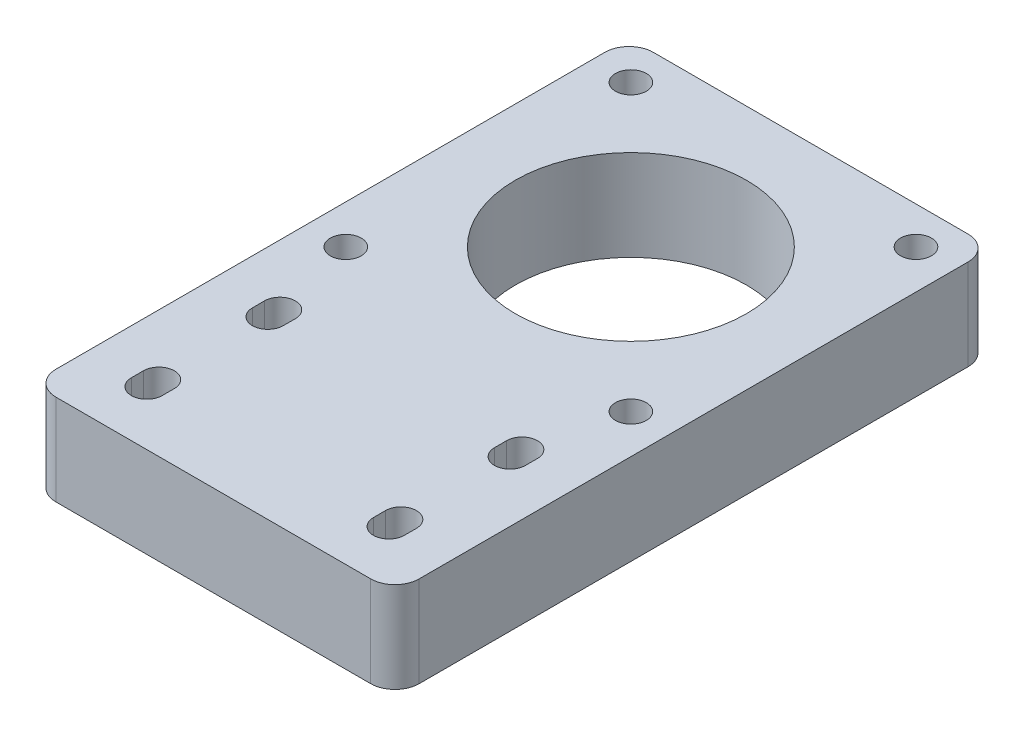
ISO-10303-21;
HEADER;
FILE_DESCRIPTION(('STEP AP214'),'2;1');
FILE_NAME('part.step','',(''),(''),'','','');
FILE_SCHEMA(('AUTOMOTIVE_DESIGN { 1 0 10303 214 1 1 1 1 }'));
ENDSEC;
DATA;
#1=APPLICATION_CONTEXT('core data for automotive mechanical design processes');
#2=APPLICATION_PROTOCOL_DEFINITION('international standard','automotive_design',2000,#1);
#3=PRODUCT_CONTEXT('',#1,'mechanical');
#4=PRODUCT('Part','Part','',(#3));
#5=PRODUCT_RELATED_PRODUCT_CATEGORY('part','',(#4));
#6=PRODUCT_DEFINITION_FORMATION('','',#4);
#7=PRODUCT_DEFINITION_CONTEXT('part definition',#1,'design');
#8=PRODUCT_DEFINITION('design','',#6,#7);
#9=PRODUCT_DEFINITION_SHAPE('','',#8);
#10=(LENGTH_UNIT() NAMED_UNIT(*) SI_UNIT(.MILLI.,.METRE.));
#11=(NAMED_UNIT(*) PLANE_ANGLE_UNIT() SI_UNIT($,.RADIAN.));
#12=(NAMED_UNIT(*) SI_UNIT($,.STERADIAN.) SOLID_ANGLE_UNIT());
#13=UNCERTAINTY_MEASURE_WITH_UNIT(LENGTH_MEASURE(1.E-05),#10,'distance_accuracy_value','');
#14=(GEOMETRIC_REPRESENTATION_CONTEXT(3) GLOBAL_UNCERTAINTY_ASSIGNED_CONTEXT((#13)) GLOBAL_UNIT_ASSIGNED_CONTEXT((#10,
#11,#12)) REPRESENTATION_CONTEXT('',''));
#15=CARTESIAN_POINT('',(0.,0.,0.));
#16=DIRECTION('',(0.,0.,1.));
#17=DIRECTION('',(1.,0.,0.));
#18=AXIS2_PLACEMENT_3D('',#15,#16,#17);
#19=CARTESIAN_POINT('',(-26.,15.,64.98));
#20=DIRECTION('',(0.,-1.,0.));
#21=DIRECTION('',(0.,0.,-1.));
#22=AXIS2_PLACEMENT_3D('',#19,#20,#21);
#23=PLANE('',#22);
#24=CARTESIAN_POINT('',(20.,15.,37.98));
#25=DIRECTION('',(0.,1.,0.));
#26=DIRECTION('',(0.,0.,1.));
#27=AXIS2_PLACEMENT_3D('',#24,#25,#26);
#28=CIRCLE('',#27,2.54999999999999);
#29=CARTESIAN_POINT('',(22.55,15.,37.98));
#30=VERTEX_POINT('',#29);
#31=CARTESIAN_POINT('',(17.45,15.,37.98));
#32=VERTEX_POINT('',#31);
#33=EDGE_CURVE('E234',#30,#32,#28,.T.);
#34=ORIENTED_EDGE('',*,*,#33,.F.);
#35=DIRECTION('',(0.,0.,-1.));
#36=VECTOR('',#35,1.);
#37=CARTESIAN_POINT('',(22.55,15.,37.98));
#38=LINE('',#37,#36);
#39=CARTESIAN_POINT('',(22.55,15.,39.98));
#40=VERTEX_POINT('',#39);
#41=EDGE_CURVE('E242',#40,#30,#38,.T.);
#42=ORIENTED_EDGE('',*,*,#41,.F.);
#43=CARTESIAN_POINT('',(20.,15.,39.98));
#44=DIRECTION('',(0.,1.,0.));
#45=DIRECTION('',(0.,0.,-1.));
#46=AXIS2_PLACEMENT_3D('',#43,#44,#45);
#47=CIRCLE('',#46,2.54999999999999);
#48=CARTESIAN_POINT('',(17.45,15.,39.98));
#49=VERTEX_POINT('',#48);
#50=EDGE_CURVE('E239',#49,#40,#47,.T.);
#51=ORIENTED_EDGE('',*,*,#50,.F.);
#52=DIRECTION('',(0.,0.,1.));
#53=VECTOR('',#52,1.);
#54=CARTESIAN_POINT('',(17.45,15.,37.98));
#55=LINE('',#54,#53);
#56=EDGE_CURVE('E236',#32,#49,#55,.T.);
#57=ORIENTED_EDGE('',*,*,#56,.F.);
#58=EDGE_LOOP('',(#34,#42,#51,#57));
#59=FACE_BOUND('',#58,.T.);
#60=CARTESIAN_POINT('',(-20.,15.,37.98));
#61=DIRECTION('',(0.,1.,0.));
#62=DIRECTION('',(0.,0.,-1.));
#63=AXIS2_PLACEMENT_3D('',#60,#61,#62);
#64=CIRCLE('',#63,2.54999999999999);
#65=CARTESIAN_POINT('',(-17.45,15.,37.98));
#66=VERTEX_POINT('',#65);
#67=CARTESIAN_POINT('',(-22.55,15.,37.98));
#68=VERTEX_POINT('',#67);
#69=EDGE_CURVE('E296',#66,#68,#64,.T.);
#70=ORIENTED_EDGE('',*,*,#69,.F.);
#71=DIRECTION('',(0.,0.,-1.));
#72=VECTOR('',#71,1.);
#73=CARTESIAN_POINT('',(-17.45,15.,37.98));
#74=LINE('',#73,#72);
#75=CARTESIAN_POINT('',(-17.45,15.,39.98));
#76=VERTEX_POINT('',#75);
#77=EDGE_CURVE('E304',#76,#66,#74,.T.);
#78=ORIENTED_EDGE('',*,*,#77,.F.);
#79=CARTESIAN_POINT('',(-20.,15.,39.98));
#80=DIRECTION('',(0.,1.,0.));
#81=DIRECTION('',(0.,0.,1.));
#82=AXIS2_PLACEMENT_3D('',#79,#80,#81);
#83=CIRCLE('',#82,2.54999999999999);
#84=CARTESIAN_POINT('',(-22.55,15.,39.98));
#85=VERTEX_POINT('',#84);
#86=EDGE_CURVE('E301',#85,#76,#83,.T.);
#87=ORIENTED_EDGE('',*,*,#86,.F.);
#88=DIRECTION('',(0.,0.,1.));
#89=VECTOR('',#88,1.);
#90=CARTESIAN_POINT('',(-22.55,15.,37.98));
#91=LINE('',#90,#89);
#92=EDGE_CURVE('E298',#68,#85,#91,.T.);
#93=ORIENTED_EDGE('',*,*,#92,.F.);
#94=EDGE_LOOP('',(#70,#78,#87,#93));
#95=FACE_BOUND('',#94,.T.);
#96=CARTESIAN_POINT('',(-26.,15.,64.98));
#97=DIRECTION('',(0.,1.,0.));
#98=DIRECTION('',(0.,0.,-1.));
#99=AXIS2_PLACEMENT_3D('',#96,#97,#98);
#100=CIRCLE('',#99,4.);
#101=CARTESIAN_POINT('',(-30.,15.,64.98));
#102=VERTEX_POINT('',#101);
#103=CARTESIAN_POINT('',(-26.,15.,68.98));
#104=VERTEX_POINT('',#103);
#105=EDGE_CURVE('E357',#102,#104,#100,.T.);
#106=ORIENTED_EDGE('',*,*,#105,.T.);
#107=DIRECTION('',(1.,0.,0.));
#108=VECTOR('',#107,1.);
#109=CARTESIAN_POINT('',(-26.,15.,68.98));
#110=LINE('',#109,#108);
#111=CARTESIAN_POINT('',(26.,15.,68.98));
#112=VERTEX_POINT('',#111);
#113=EDGE_CURVE('E360',#104,#112,#110,.T.);
#114=ORIENTED_EDGE('',*,*,#113,.T.);
#115=CARTESIAN_POINT('',(26.,15.,64.98));
#116=DIRECTION('',(0.,1.,0.));
#117=DIRECTION('',(0.,0.,1.));
#118=AXIS2_PLACEMENT_3D('',#115,#116,#117);
#119=CIRCLE('',#118,4.);
#120=CARTESIAN_POINT('',(30.,15.,64.98));
#121=VERTEX_POINT('',#120);
#122=EDGE_CURVE('E363',#112,#121,#119,.T.);
#123=ORIENTED_EDGE('',*,*,#122,.T.);
#124=DIRECTION('',(0.,0.,-1.));
#125=VECTOR('',#124,1.);
#126=CARTESIAN_POINT('',(30.,15.,-25.7));
#127=LINE('',#126,#125);
#128=CARTESIAN_POINT('',(30.,15.,-25.7));
#129=VERTEX_POINT('',#128);
#130=EDGE_CURVE('E365',#121,#129,#127,.T.);
#131=ORIENTED_EDGE('',*,*,#130,.T.);
#132=CARTESIAN_POINT('',(26.,15.,-25.7));
#133=DIRECTION('',(0.,1.,0.));
#134=DIRECTION('',(0.,0.,1.));
#135=AXIS2_PLACEMENT_3D('',#132,#133,#134);
#136=CIRCLE('',#135,4.);
#137=CARTESIAN_POINT('',(26.,15.,-29.7));
#138=VERTEX_POINT('',#137);
#139=EDGE_CURVE('E367',#129,#138,#136,.T.);
#140=ORIENTED_EDGE('',*,*,#139,.T.);
#141=DIRECTION('',(-1.,0.,0.));
#142=VECTOR('',#141,1.);
#143=CARTESIAN_POINT('',(-26.,15.,-29.7));
#144=LINE('',#143,#142);
#145=CARTESIAN_POINT('',(-26.,15.,-29.7));
#146=VERTEX_POINT('',#145);
#147=EDGE_CURVE('E369',#138,#146,#144,.T.);
#148=ORIENTED_EDGE('',*,*,#147,.T.);
#149=CARTESIAN_POINT('',(-26.,15.,-25.7));
#150=DIRECTION('',(0.,1.,0.));
#151=DIRECTION('',(0.,0.,1.));
#152=AXIS2_PLACEMENT_3D('',#149,#150,#151);
#153=CIRCLE('',#152,4.);
#154=CARTESIAN_POINT('',(-30.,15.,-25.7));
#155=VERTEX_POINT('',#154);
#156=EDGE_CURVE('E371',#146,#155,#153,.T.);
#157=ORIENTED_EDGE('',*,*,#156,.T.);
#158=DIRECTION('',(0.,0.,1.));
#159=VECTOR('',#158,1.);
#160=CARTESIAN_POINT('',(-30.,15.,-25.7));
#161=LINE('',#160,#159);
#162=EDGE_CURVE('E373',#155,#102,#161,.T.);
#163=ORIENTED_EDGE('',*,*,#162,.T.);
#164=EDGE_LOOP('',(#106,#114,#123,#131,#140,#148,#157,#163));
#165=FACE_BOUND('',#164,.T.);
#166=CARTESIAN_POINT('',(0.,15.,0.));
#167=DIRECTION('',(0.,1.,0.));
#168=DIRECTION('',(0.,0.,1.));
#169=AXIS2_PLACEMENT_3D('',#166,#167,#168);
#170=CIRCLE('',#169,19.1);
#171=CARTESIAN_POINT('',(0.,15.,19.1));
#172=VERTEX_POINT('',#171);
#173=EDGE_CURVE('E351',#172,#172,#170,.T.);
#174=ORIENTED_EDGE('',*,*,#173,.F.);
#175=EDGE_LOOP('',(#174));
#176=FACE_BOUND('',#175,.T.);
#177=CARTESIAN_POINT('',(-23.55,15.,-23.55));
#178=DIRECTION('',(0.,1.,0.));
#179=DIRECTION('',(0.,0.,1.));
#180=AXIS2_PLACEMENT_3D('',#177,#178,#179);
#181=CIRCLE('',#180,2.55);
#182=CARTESIAN_POINT('',(-23.55,15.,-21.));
#183=VERTEX_POINT('',#182);
#184=EDGE_CURVE('E345',#183,#183,#181,.T.);
#185=ORIENTED_EDGE('',*,*,#184,.F.);
#186=EDGE_LOOP('',(#185));
#187=FACE_BOUND('',#186,.T.);
#188=CARTESIAN_POINT('',(23.55,15.,-23.55));
#189=DIRECTION('',(0.,1.,0.));
#190=DIRECTION('',(0.,0.,-1.));
#191=AXIS2_PLACEMENT_3D('',#188,#189,#190);
#192=CIRCLE('',#191,2.55);
#193=CARTESIAN_POINT('',(23.55,15.,-26.1));
#194=VERTEX_POINT('',#193);
#195=EDGE_CURVE('E339',#194,#194,#192,.T.);
#196=ORIENTED_EDGE('',*,*,#195,.F.);
#197=EDGE_LOOP('',(#196));
#198=FACE_BOUND('',#197,.T.);
#199=CARTESIAN_POINT('',(23.55,15.,23.55));
#200=DIRECTION('',(0.,1.,0.));
#201=DIRECTION('',(0.,0.,1.));
#202=AXIS2_PLACEMENT_3D('',#199,#200,#201);
#203=CIRCLE('',#202,2.55);
#204=CARTESIAN_POINT('',(23.55,15.,26.1));
#205=VERTEX_POINT('',#204);
#206=EDGE_CURVE('E333',#205,#205,#203,.T.);
#207=ORIENTED_EDGE('',*,*,#206,.F.);
#208=EDGE_LOOP('',(#207));
#209=FACE_BOUND('',#208,.T.);
#210=CARTESIAN_POINT('',(-23.55,15.,23.55));
#211=DIRECTION('',(0.,1.,0.));
#212=DIRECTION('',(0.,0.,-1.));
#213=AXIS2_PLACEMENT_3D('',#210,#211,#212);
#214=CIRCLE('',#213,2.55);
#215=CARTESIAN_POINT('',(-23.55,15.,21.));
#216=VERTEX_POINT('',#215);
#217=EDGE_CURVE('E327',#216,#216,#214,.T.);
#218=ORIENTED_EDGE('',*,*,#217,.F.);
#219=EDGE_LOOP('',(#218));
#220=FACE_BOUND('',#219,.T.);
#221=CARTESIAN_POINT('',(-20.,15.,57.98));
#222=DIRECTION('',(0.,1.,0.));
#223=DIRECTION('',(0.,0.,-1.));
#224=AXIS2_PLACEMENT_3D('',#221,#222,#223);
#225=CIRCLE('',#224,2.55);
#226=CARTESIAN_POINT('',(-17.45,15.,57.98));
#227=VERTEX_POINT('',#226);
#228=CARTESIAN_POINT('',(-22.55,15.,57.98));
#229=VERTEX_POINT('',#228);
#230=EDGE_CURVE('E265',#227,#229,#225,.T.);
#231=ORIENTED_EDGE('',*,*,#230,.F.);
#232=DIRECTION('',(0.,0.,-1.));
#233=VECTOR('',#232,1.);
#234=CARTESIAN_POINT('',(-17.45,15.,59.98));
#235=LINE('',#234,#233);
#236=CARTESIAN_POINT('',(-17.45,15.,59.98));
#237=VERTEX_POINT('',#236);
#238=EDGE_CURVE('E273',#237,#227,#235,.T.);
#239=ORIENTED_EDGE('',*,*,#238,.F.);
#240=CARTESIAN_POINT('',(-20.,15.,59.98));
#241=DIRECTION('',(0.,1.,0.));
#242=DIRECTION('',(0.,0.,1.));
#243=AXIS2_PLACEMENT_3D('',#240,#241,#242);
#244=CIRCLE('',#243,2.55);
#245=CARTESIAN_POINT('',(-22.55,15.,59.98));
#246=VERTEX_POINT('',#245);
#247=EDGE_CURVE('E270',#246,#237,#244,.T.);
#248=ORIENTED_EDGE('',*,*,#247,.F.);
#249=DIRECTION('',(0.,0.,1.));
#250=VECTOR('',#249,1.);
#251=CARTESIAN_POINT('',(-22.55,15.,59.98));
#252=LINE('',#251,#250);
#253=EDGE_CURVE('E267',#229,#246,#252,.T.);
#254=ORIENTED_EDGE('',*,*,#253,.F.);
#255=EDGE_LOOP('',(#231,#239,#248,#254));
#256=FACE_BOUND('',#255,.T.);
#257=CARTESIAN_POINT('',(20.,15.,57.98));
#258=DIRECTION('',(0.,1.,0.));
#259=DIRECTION('',(0.,0.,1.));
#260=AXIS2_PLACEMENT_3D('',#257,#258,#259);
#261=CIRCLE('',#260,2.55);
#262=CARTESIAN_POINT('',(22.55,15.,57.98));
#263=VERTEX_POINT('',#262);
#264=CARTESIAN_POINT('',(17.45,15.,57.98));
#265=VERTEX_POINT('',#264);
#266=EDGE_CURVE('E198',#263,#265,#261,.T.);
#267=ORIENTED_EDGE('',*,*,#266,.F.);
#268=DIRECTION('',(0.,0.,-1.));
#269=VECTOR('',#268,1.);
#270=CARTESIAN_POINT('',(22.55,15.,59.98));
#271=LINE('',#270,#269);
#272=CARTESIAN_POINT('',(22.55,15.,59.98));
#273=VERTEX_POINT('',#272);
#274=EDGE_CURVE('E220',#273,#263,#271,.T.);
#275=ORIENTED_EDGE('',*,*,#274,.F.);
#276=CARTESIAN_POINT('',(20.,15.,59.98));
#277=DIRECTION('',(0.,1.,0.));
#278=DIRECTION('',(0.,0.,-1.));
#279=AXIS2_PLACEMENT_3D('',#276,#277,#278);
#280=CIRCLE('',#279,2.55);
#281=CARTESIAN_POINT('',(17.45,15.,59.98));
#282=VERTEX_POINT('',#281);
#283=EDGE_CURVE('E218',#282,#273,#280,.T.);
#284=ORIENTED_EDGE('',*,*,#283,.F.);
#285=DIRECTION('',(0.,0.,1.));
#286=VECTOR('',#285,1.);
#287=CARTESIAN_POINT('',(17.45,15.,59.98));
#288=LINE('',#287,#286);
#289=EDGE_CURVE('E206',#265,#282,#288,.T.);
#290=ORIENTED_EDGE('',*,*,#289,.F.);
#291=EDGE_LOOP('',(#267,#275,#284,#290));
#292=FACE_BOUND('',#291,.T.);
#293=ADVANCED_FACE('F37',(#59,#95,#165,#176,#187,#198,#209,#220,#256,#292),#23,.F.);
#294=CARTESIAN_POINT('',(-26.,0.,64.98));
#295=DIRECTION('',(0.,-1.,0.));
#296=DIRECTION('',(0.,0.,-1.));
#297=AXIS2_PLACEMENT_3D('',#294,#295,#296);
#298=PLANE('',#297);
#299=CARTESIAN_POINT('',(23.55,0.,23.55));
#300=DIRECTION('',(0.,1.,0.));
#301=DIRECTION('',(0.,0.,1.));
#302=AXIS2_PLACEMENT_3D('',#299,#300,#301);
#303=CIRCLE('',#302,2.55);
#304=CARTESIAN_POINT('',(23.55,0.,26.1));
#305=VERTEX_POINT('',#304);
#306=EDGE_CURVE('E330',#305,#305,#303,.T.);
#307=ORIENTED_EDGE('',*,*,#306,.T.);
#308=EDGE_LOOP('',(#307));
#309=FACE_BOUND('',#308,.T.);
#310=CARTESIAN_POINT('',(-23.55,0.,-23.55));
#311=DIRECTION('',(0.,1.,0.));
#312=DIRECTION('',(0.,0.,1.));
#313=AXIS2_PLACEMENT_3D('',#310,#311,#312);
#314=CIRCLE('',#313,2.55);
#315=CARTESIAN_POINT('',(-23.55,0.,-21.));
#316=VERTEX_POINT('',#315);
#317=EDGE_CURVE('E342',#316,#316,#314,.T.);
#318=ORIENTED_EDGE('',*,*,#317,.T.);
#319=EDGE_LOOP('',(#318));
#320=FACE_BOUND('',#319,.T.);
#321=CARTESIAN_POINT('',(-26.,0.,64.98));
#322=DIRECTION('',(0.,1.,0.));
#323=DIRECTION('',(0.,0.,-1.));
#324=AXIS2_PLACEMENT_3D('',#321,#322,#323);
#325=CIRCLE('',#324,4.);
#326=CARTESIAN_POINT('',(-30.,0.,64.98));
#327=VERTEX_POINT('',#326);
#328=CARTESIAN_POINT('',(-26.,0.,68.98));
#329=VERTEX_POINT('',#328);
#330=EDGE_CURVE('E354',#327,#329,#325,.T.);
#331=ORIENTED_EDGE('',*,*,#330,.F.);
#332=DIRECTION('',(0.,0.,1.));
#333=VECTOR('',#332,1.);
#334=CARTESIAN_POINT('',(-30.,0.,-25.7));
#335=LINE('',#334,#333);
#336=CARTESIAN_POINT('',(-30.,0.,-25.7));
#337=VERTEX_POINT('',#336);
#338=EDGE_CURVE('E361',#337,#327,#335,.T.);
#339=ORIENTED_EDGE('',*,*,#338,.F.);
#340=CARTESIAN_POINT('',(-26.,0.,-25.7));
#341=DIRECTION('',(0.,1.,0.));
#342=DIRECTION('',(0.,0.,1.));
#343=AXIS2_PLACEMENT_3D('',#340,#341,#342);
#344=CIRCLE('',#343,4.);
#345=CARTESIAN_POINT('',(-26.,0.,-29.7));
#346=VERTEX_POINT('',#345);
#347=EDGE_CURVE('E388',#346,#337,#344,.T.);
#348=ORIENTED_EDGE('',*,*,#347,.F.);
#349=DIRECTION('',(-1.,0.,0.));
#350=VECTOR('',#349,1.);
#351=CARTESIAN_POINT('',(-26.,0.,-29.7));
#352=LINE('',#351,#350);
#353=CARTESIAN_POINT('',(26.,0.,-29.7));
#354=VERTEX_POINT('',#353);
#355=EDGE_CURVE('E386',#354,#346,#352,.T.);
#356=ORIENTED_EDGE('',*,*,#355,.F.);
#357=CARTESIAN_POINT('',(26.,0.,-25.7));
#358=DIRECTION('',(0.,1.,0.));
#359=DIRECTION('',(0.,0.,1.));
#360=AXIS2_PLACEMENT_3D('',#357,#358,#359);
#361=CIRCLE('',#360,4.);
#362=CARTESIAN_POINT('',(30.,0.,-25.7));
#363=VERTEX_POINT('',#362);
#364=EDGE_CURVE('E384',#363,#354,#361,.T.);
#365=ORIENTED_EDGE('',*,*,#364,.F.);
#366=DIRECTION('',(0.,0.,-1.));
#367=VECTOR('',#366,1.);
#368=CARTESIAN_POINT('',(30.,0.,-25.7));
#369=LINE('',#368,#367);
#370=CARTESIAN_POINT('',(30.,0.,64.98));
#371=VERTEX_POINT('',#370);
#372=EDGE_CURVE('E382',#371,#363,#369,.T.);
#373=ORIENTED_EDGE('',*,*,#372,.F.);
#374=CARTESIAN_POINT('',(26.,0.,64.98));
#375=DIRECTION('',(0.,1.,0.));
#376=DIRECTION('',(0.,0.,1.));
#377=AXIS2_PLACEMENT_3D('',#374,#375,#376);
#378=CIRCLE('',#377,4.);
#379=CARTESIAN_POINT('',(26.,0.,68.98));
#380=VERTEX_POINT('',#379);
#381=EDGE_CURVE('E380',#380,#371,#378,.T.);
#382=ORIENTED_EDGE('',*,*,#381,.F.);
#383=DIRECTION('',(1.,0.,0.));
#384=VECTOR('',#383,1.);
#385=CARTESIAN_POINT('',(-26.,0.,68.98));
#386=LINE('',#385,#384);
#387=EDGE_CURVE('E378',#329,#380,#386,.T.);
#388=ORIENTED_EDGE('',*,*,#387,.F.);
#389=EDGE_LOOP('',(#331,#339,#348,#356,#365,#373,#382,#388));
#390=FACE_BOUND('',#389,.T.);
#391=CARTESIAN_POINT('',(0.,0.,0.));
#392=DIRECTION('',(0.,1.,0.));
#393=DIRECTION('',(0.,0.,1.));
#394=AXIS2_PLACEMENT_3D('',#391,#392,#393);
#395=CIRCLE('',#394,19.1);
#396=CARTESIAN_POINT('',(0.,0.,19.1));
#397=VERTEX_POINT('',#396);
#398=EDGE_CURVE('E348',#397,#397,#395,.T.);
#399=ORIENTED_EDGE('',*,*,#398,.T.);
#400=EDGE_LOOP('',(#399));
#401=FACE_BOUND('',#400,.T.);
#402=CARTESIAN_POINT('',(23.55,0.,-23.55));
#403=DIRECTION('',(0.,1.,0.));
#404=DIRECTION('',(0.,0.,-1.));
#405=AXIS2_PLACEMENT_3D('',#402,#403,#404);
#406=CIRCLE('',#405,2.55);
#407=CARTESIAN_POINT('',(23.55,0.,-26.1));
#408=VERTEX_POINT('',#407);
#409=EDGE_CURVE('E336',#408,#408,#406,.T.);
#410=ORIENTED_EDGE('',*,*,#409,.T.);
#411=EDGE_LOOP('',(#410));
#412=FACE_BOUND('',#411,.T.);
#413=CARTESIAN_POINT('',(-23.55,0.,23.55));
#414=DIRECTION('',(0.,1.,0.));
#415=DIRECTION('',(0.,0.,-1.));
#416=AXIS2_PLACEMENT_3D('',#413,#414,#415);
#417=CIRCLE('',#416,2.55);
#418=CARTESIAN_POINT('',(-23.55,0.,21.));
#419=VERTEX_POINT('',#418);
#420=EDGE_CURVE('E326',#419,#419,#417,.T.);
#421=ORIENTED_EDGE('',*,*,#420,.T.);
#422=EDGE_LOOP('',(#421));
#423=FACE_BOUND('',#422,.T.);
#424=DIRECTION('',(0.,0.,-1.));
#425=VECTOR('',#424,1.);
#426=CARTESIAN_POINT('',(-17.45,0.,37.98));
#427=LINE('',#426,#425);
#428=CARTESIAN_POINT('',(-17.45,0.,39.98));
#429=VERTEX_POINT('',#428);
#430=CARTESIAN_POINT('',(-17.45,0.,37.98));
#431=VERTEX_POINT('',#430);
#432=EDGE_CURVE('E299',#429,#431,#427,.T.);
#433=ORIENTED_EDGE('',*,*,#432,.T.);
#434=CARTESIAN_POINT('',(-20.,0.,37.98));
#435=DIRECTION('',(0.,1.,0.));
#436=DIRECTION('',(0.,0.,-1.));
#437=AXIS2_PLACEMENT_3D('',#434,#435,#436);
#438=CIRCLE('',#437,2.54999999999999);
#439=CARTESIAN_POINT('',(-22.55,0.,37.98));
#440=VERTEX_POINT('',#439);
#441=EDGE_CURVE('E295',#431,#440,#438,.T.);
#442=ORIENTED_EDGE('',*,*,#441,.T.);
#443=DIRECTION('',(0.,0.,1.));
#444=VECTOR('',#443,1.);
#445=CARTESIAN_POINT('',(-22.55,0.,37.98));
#446=LINE('',#445,#444);
#447=CARTESIAN_POINT('',(-22.55,0.,39.98));
#448=VERTEX_POINT('',#447);
#449=EDGE_CURVE('E309',#440,#448,#446,.T.);
#450=ORIENTED_EDGE('',*,*,#449,.T.);
#451=CARTESIAN_POINT('',(-20.,0.,39.98));
#452=DIRECTION('',(0.,1.,0.));
#453=DIRECTION('',(0.,0.,1.));
#454=AXIS2_PLACEMENT_3D('',#451,#452,#453);
#455=CIRCLE('',#454,2.54999999999999);
#456=EDGE_CURVE('E312',#448,#429,#455,.T.);
#457=ORIENTED_EDGE('',*,*,#456,.T.);
#458=EDGE_LOOP('',(#433,#442,#450,#457));
#459=FACE_BOUND('',#458,.T.);
#460=DIRECTION('',(0.,0.,-1.));
#461=VECTOR('',#460,1.);
#462=CARTESIAN_POINT('',(-17.45,0.,59.98));
#463=LINE('',#462,#461);
#464=CARTESIAN_POINT('',(-17.45,0.,59.98));
#465=VERTEX_POINT('',#464);
#466=CARTESIAN_POINT('',(-17.45,0.,57.98));
#467=VERTEX_POINT('',#466);
#468=EDGE_CURVE('E268',#465,#467,#463,.T.);
#469=ORIENTED_EDGE('',*,*,#468,.T.);
#470=CARTESIAN_POINT('',(-20.,0.,57.98));
#471=DIRECTION('',(0.,1.,0.));
#472=DIRECTION('',(0.,0.,-1.));
#473=AXIS2_PLACEMENT_3D('',#470,#471,#472);
#474=CIRCLE('',#473,2.55);
#475=CARTESIAN_POINT('',(-22.55,0.,57.98));
#476=VERTEX_POINT('',#475);
#477=EDGE_CURVE('E264',#467,#476,#474,.T.);
#478=ORIENTED_EDGE('',*,*,#477,.T.);
#479=DIRECTION('',(0.,0.,1.));
#480=VECTOR('',#479,1.);
#481=CARTESIAN_POINT('',(-22.55,0.,59.98));
#482=LINE('',#481,#480);
#483=CARTESIAN_POINT('',(-22.55,0.,59.98));
#484=VERTEX_POINT('',#483);
#485=EDGE_CURVE('E278',#476,#484,#482,.T.);
#486=ORIENTED_EDGE('',*,*,#485,.T.);
#487=CARTESIAN_POINT('',(-20.,0.,59.98));
#488=DIRECTION('',(0.,1.,0.));
#489=DIRECTION('',(0.,0.,1.));
#490=AXIS2_PLACEMENT_3D('',#487,#488,#489);
#491=CIRCLE('',#490,2.55);
#492=EDGE_CURVE('E281',#484,#465,#491,.T.);
#493=ORIENTED_EDGE('',*,*,#492,.T.);
#494=EDGE_LOOP('',(#469,#478,#486,#493));
#495=FACE_BOUND('',#494,.T.);
#496=DIRECTION('',(0.,0.,-1.));
#497=VECTOR('',#496,1.);
#498=CARTESIAN_POINT('',(22.55,0.,37.98));
#499=LINE('',#498,#497);
#500=CARTESIAN_POINT('',(22.55,0.,39.98));
#501=VERTEX_POINT('',#500);
#502=CARTESIAN_POINT('',(22.55,0.,37.98));
#503=VERTEX_POINT('',#502);
#504=EDGE_CURVE('E237',#501,#503,#499,.T.);
#505=ORIENTED_EDGE('',*,*,#504,.T.);
#506=CARTESIAN_POINT('',(20.,0.,37.98));
#507=DIRECTION('',(0.,1.,0.));
#508=DIRECTION('',(0.,0.,1.));
#509=AXIS2_PLACEMENT_3D('',#506,#507,#508);
#510=CIRCLE('',#509,2.54999999999999);
#511=CARTESIAN_POINT('',(17.45,0.,37.98));
#512=VERTEX_POINT('',#511);
#513=EDGE_CURVE('E214',#503,#512,#510,.T.);
#514=ORIENTED_EDGE('',*,*,#513,.T.);
#515=DIRECTION('',(0.,0.,1.));
#516=VECTOR('',#515,1.);
#517=CARTESIAN_POINT('',(17.45,0.,37.98));
#518=LINE('',#517,#516);
#519=CARTESIAN_POINT('',(17.45,0.,39.98));
#520=VERTEX_POINT('',#519);
#521=EDGE_CURVE('E247',#512,#520,#518,.T.);
#522=ORIENTED_EDGE('',*,*,#521,.T.);
#523=CARTESIAN_POINT('',(20.,0.,39.98));
#524=DIRECTION('',(0.,1.,0.));
#525=DIRECTION('',(0.,0.,-1.));
#526=AXIS2_PLACEMENT_3D('',#523,#524,#525);
#527=CIRCLE('',#526,2.54999999999999);
#528=EDGE_CURVE('E250',#520,#501,#527,.T.);
#529=ORIENTED_EDGE('',*,*,#528,.T.);
#530=EDGE_LOOP('',(#505,#514,#522,#529));
#531=FACE_BOUND('',#530,.T.);
#532=DIRECTION('',(0.,0.,-1.));
#533=VECTOR('',#532,1.);
#534=CARTESIAN_POINT('',(22.55,0.,59.98));
#535=LINE('',#534,#533);
#536=CARTESIAN_POINT('',(22.55,0.,59.98));
#537=VERTEX_POINT('',#536);
#538=CARTESIAN_POINT('',(22.55,0.,57.98));
#539=VERTEX_POINT('',#538);
#540=EDGE_CURVE('E207',#537,#539,#535,.T.);
#541=ORIENTED_EDGE('',*,*,#540,.T.);
#542=CARTESIAN_POINT('',(20.,0.,57.98));
#543=DIRECTION('',(0.,1.,0.));
#544=DIRECTION('',(0.,0.,1.));
#545=AXIS2_PLACEMENT_3D('',#542,#543,#544);
#546=CIRCLE('',#545,2.55);
#547=CARTESIAN_POINT('',(17.45,0.,57.98));
#548=VERTEX_POINT('',#547);
#549=EDGE_CURVE('E60',#539,#548,#546,.T.);
#550=ORIENTED_EDGE('',*,*,#549,.T.);
#551=DIRECTION('',(0.,0.,1.));
#552=VECTOR('',#551,1.);
#553=CARTESIAN_POINT('',(17.45,0.,59.98));
#554=LINE('',#553,#552);
#555=CARTESIAN_POINT('',(17.45,0.,59.98));
#556=VERTEX_POINT('',#555);
#557=EDGE_CURVE('E213',#548,#556,#554,.T.);
#558=ORIENTED_EDGE('',*,*,#557,.T.);
#559=CARTESIAN_POINT('',(20.,0.,59.98));
#560=DIRECTION('',(0.,1.,0.));
#561=DIRECTION('',(0.,0.,-1.));
#562=AXIS2_PLACEMENT_3D('',#559,#560,#561);
#563=CIRCLE('',#562,2.55);
#564=EDGE_CURVE('E226',#556,#537,#563,.T.);
#565=ORIENTED_EDGE('',*,*,#564,.T.);
#566=EDGE_LOOP('',(#541,#550,#558,#565));
#567=FACE_BOUND('',#566,.T.);
#568=ADVANCED_FACE('F418',(#309,#320,#390,#401,#412,#423,#459,#495,#531,#567),#298,.T.);
#569=CARTESIAN_POINT('',(-26.,15.,64.98));
#570=DIRECTION('',(0.,-1.,0.));
#571=DIRECTION('',(0.,0.,-1.));
#572=AXIS2_PLACEMENT_3D('',#569,#570,#571);
#573=CYLINDRICAL_SURFACE('',#572,4.);
#574=ORIENTED_EDGE('',*,*,#330,.T.);
#575=DIRECTION('',(0.,-1.,0.));
#576=VECTOR('',#575,1.);
#577=CARTESIAN_POINT('',(-26.,15.,68.98));
#578=LINE('',#577,#576);
#579=EDGE_CURVE('E11',#104,#329,#578,.T.);
#580=ORIENTED_EDGE('',*,*,#579,.F.);
#581=ORIENTED_EDGE('',*,*,#105,.F.);
#582=DIRECTION('',(0.,-1.,0.));
#583=VECTOR('',#582,1.);
#584=CARTESIAN_POINT('',(-30.,15.,64.98));
#585=LINE('',#584,#583);
#586=EDGE_CURVE('E375',#102,#327,#585,.T.);
#587=ORIENTED_EDGE('',*,*,#586,.T.);
#588=EDGE_LOOP('',(#574,#580,#581,#587));
#589=FACE_BOUND('',#588,.T.);
#590=ADVANCED_FACE('F39',(#589),#573,.T.);
#591=CARTESIAN_POINT('',(-26.,15.,68.98));
#592=DIRECTION('',(0.,0.,-1.));
#593=DIRECTION('',(-1.,0.,0.));
#594=AXIS2_PLACEMENT_3D('',#591,#592,#593);
#595=PLANE('',#594);
#596=ORIENTED_EDGE('',*,*,#387,.T.);
#597=DIRECTION('',(0.,-1.,0.));
#598=VECTOR('',#597,1.);
#599=CARTESIAN_POINT('',(26.,15.,68.98));
#600=LINE('',#599,#598);
#601=EDGE_CURVE('E45',#112,#380,#600,.T.);
#602=ORIENTED_EDGE('',*,*,#601,.F.);
#603=ORIENTED_EDGE('',*,*,#113,.F.);
#604=ORIENTED_EDGE('',*,*,#579,.T.);
#605=EDGE_LOOP('',(#596,#602,#603,#604));
#606=FACE_BOUND('',#605,.T.);
#607=ADVANCED_FACE('F436',(#606),#595,.F.);
#608=CARTESIAN_POINT('',(26.,15.,64.98));
#609=DIRECTION('',(0.,-1.,0.));
#610=DIRECTION('',(0.,0.,-1.));
#611=AXIS2_PLACEMENT_3D('',#608,#609,#610);
#612=CYLINDRICAL_SURFACE('',#611,4.);
#613=ORIENTED_EDGE('',*,*,#381,.T.);
#614=DIRECTION('',(0.,-1.,0.));
#615=VECTOR('',#614,1.);
#616=CARTESIAN_POINT('',(30.,15.,64.98));
#617=LINE('',#616,#615);
#618=EDGE_CURVE('E405',#121,#371,#617,.T.);
#619=ORIENTED_EDGE('',*,*,#618,.F.);
#620=ORIENTED_EDGE('',*,*,#122,.F.);
#621=ORIENTED_EDGE('',*,*,#601,.T.);
#622=EDGE_LOOP('',(#613,#619,#620,#621));
#623=FACE_BOUND('',#622,.T.);
#624=ADVANCED_FACE('F412',(#623),#612,.T.);
#625=CARTESIAN_POINT('',(30.,15.,-25.7));
#626=DIRECTION('',(-1.,0.,0.));
#627=DIRECTION('',(0.,0.,1.));
#628=AXIS2_PLACEMENT_3D('',#625,#626,#627);
#629=PLANE('',#628);
#630=ORIENTED_EDGE('',*,*,#372,.T.);
#631=DIRECTION('',(0.,-1.,0.));
#632=VECTOR('',#631,1.);
#633=CARTESIAN_POINT('',(30.,15.,-25.7));
#634=LINE('',#633,#632);
#635=EDGE_CURVE('E402',#129,#363,#634,.T.);
#636=ORIENTED_EDGE('',*,*,#635,.F.);
#637=ORIENTED_EDGE('',*,*,#130,.F.);
#638=ORIENTED_EDGE('',*,*,#618,.T.);
#639=EDGE_LOOP('',(#630,#636,#637,#638));
#640=FACE_BOUND('',#639,.T.);
#641=ADVANCED_FACE('F424',(#640),#629,.F.);
#642=CARTESIAN_POINT('',(26.,15.,-25.7));
#643=DIRECTION('',(0.,-1.,0.));
#644=DIRECTION('',(0.,0.,-1.));
#645=AXIS2_PLACEMENT_3D('',#642,#643,#644);
#646=CYLINDRICAL_SURFACE('',#645,4.);
#647=ORIENTED_EDGE('',*,*,#364,.T.);
#648=DIRECTION('',(0.,-1.,0.));
#649=VECTOR('',#648,1.);
#650=CARTESIAN_POINT('',(26.,15.,-29.7));
#651=LINE('',#650,#649);
#652=EDGE_CURVE('E399',#138,#354,#651,.T.);
#653=ORIENTED_EDGE('',*,*,#652,.F.);
#654=ORIENTED_EDGE('',*,*,#139,.F.);
#655=ORIENTED_EDGE('',*,*,#635,.T.);
#656=EDGE_LOOP('',(#647,#653,#654,#655));
#657=FACE_BOUND('',#656,.T.);
#658=ADVANCED_FACE('F428',(#657),#646,.T.);
#659=CARTESIAN_POINT('',(-26.,15.,-29.7));
#660=DIRECTION('',(0.,0.,1.));
#661=DIRECTION('',(1.,0.,0.));
#662=AXIS2_PLACEMENT_3D('',#659,#660,#661);
#663=PLANE('',#662);
#664=ORIENTED_EDGE('',*,*,#355,.T.);
#665=DIRECTION('',(0.,-1.,0.));
#666=VECTOR('',#665,1.);
#667=CARTESIAN_POINT('',(-26.,15.,-29.7));
#668=LINE('',#667,#666);
#669=EDGE_CURVE('E396',#146,#346,#668,.T.);
#670=ORIENTED_EDGE('',*,*,#669,.F.);
#671=ORIENTED_EDGE('',*,*,#147,.F.);
#672=ORIENTED_EDGE('',*,*,#652,.T.);
#673=EDGE_LOOP('',(#664,#670,#671,#672));
#674=FACE_BOUND('',#673,.T.);
#675=ADVANCED_FACE('F449',(#674),#663,.F.);
#676=CARTESIAN_POINT('',(-26.,15.,-25.7));
#677=DIRECTION('',(0.,-1.,0.));
#678=DIRECTION('',(0.,0.,-1.));
#679=AXIS2_PLACEMENT_3D('',#676,#677,#678);
#680=CYLINDRICAL_SURFACE('',#679,4.);
#681=ORIENTED_EDGE('',*,*,#347,.T.);
#682=DIRECTION('',(0.,-1.,0.));
#683=VECTOR('',#682,1.);
#684=CARTESIAN_POINT('',(-30.,15.,-25.7));
#685=LINE('',#684,#683);
#686=EDGE_CURVE('E393',#155,#337,#685,.T.);
#687=ORIENTED_EDGE('',*,*,#686,.F.);
#688=ORIENTED_EDGE('',*,*,#156,.F.);
#689=ORIENTED_EDGE('',*,*,#669,.T.);
#690=EDGE_LOOP('',(#681,#687,#688,#689));
#691=FACE_BOUND('',#690,.T.);
#692=ADVANCED_FACE('F447',(#691),#680,.T.);
#693=CARTESIAN_POINT('',(-30.,15.,-25.7));
#694=DIRECTION('',(1.,0.,0.));
#695=DIRECTION('',(0.,0.,-1.));
#696=AXIS2_PLACEMENT_3D('',#693,#694,#695);
#697=PLANE('',#696);
#698=ORIENTED_EDGE('',*,*,#338,.T.);
#699=ORIENTED_EDGE('',*,*,#586,.F.);
#700=ORIENTED_EDGE('',*,*,#162,.F.);
#701=ORIENTED_EDGE('',*,*,#686,.T.);
#702=EDGE_LOOP('',(#698,#699,#700,#701));
#703=FACE_BOUND('',#702,.T.);
#704=ADVANCED_FACE('F442',(#703),#697,.F.);
#705=CARTESIAN_POINT('',(0.,15.,0.));
#706=DIRECTION('',(0.,-1.,0.));
#707=DIRECTION('',(0.,0.,-1.));
#708=AXIS2_PLACEMENT_3D('',#705,#706,#707);
#709=CYLINDRICAL_SURFACE('',#708,19.1);
#710=ORIENTED_EDGE('',*,*,#173,.T.);
#711=EDGE_LOOP('',(#710));
#712=FACE_BOUND('',#711,.T.);
#713=ORIENTED_EDGE('',*,*,#398,.F.);
#714=EDGE_LOOP('',(#713));
#715=FACE_BOUND('',#714,.T.);
#716=ADVANCED_FACE('F469',(#712,#715),#709,.F.);
#717=CARTESIAN_POINT('',(-23.55,15.,-23.55));
#718=DIRECTION('',(0.,-1.,0.));
#719=DIRECTION('',(0.,0.,-1.));
#720=AXIS2_PLACEMENT_3D('',#717,#718,#719);
#721=CYLINDRICAL_SURFACE('',#720,2.55);
#722=ORIENTED_EDGE('',*,*,#184,.T.);
#723=EDGE_LOOP('',(#722));
#724=FACE_BOUND('',#723,.T.);
#725=ORIENTED_EDGE('',*,*,#317,.F.);
#726=EDGE_LOOP('',(#725));
#727=FACE_BOUND('',#726,.T.);
#728=ADVANCED_FACE('F476',(#724,#727),#721,.F.);
#729=CARTESIAN_POINT('',(23.55,15.,-23.55));
#730=DIRECTION('',(0.,-1.,0.));
#731=DIRECTION('',(0.,0.,-1.));
#732=AXIS2_PLACEMENT_3D('',#729,#730,#731);
#733=CYLINDRICAL_SURFACE('',#732,2.55);
#734=ORIENTED_EDGE('',*,*,#195,.T.);
#735=EDGE_LOOP('',(#734));
#736=FACE_BOUND('',#735,.T.);
#737=ORIENTED_EDGE('',*,*,#409,.F.);
#738=EDGE_LOOP('',(#737));
#739=FACE_BOUND('',#738,.T.);
#740=ADVANCED_FACE('F481',(#736,#739),#733,.F.);
#741=CARTESIAN_POINT('',(23.55,15.,23.55));
#742=DIRECTION('',(0.,-1.,0.));
#743=DIRECTION('',(0.,0.,-1.));
#744=AXIS2_PLACEMENT_3D('',#741,#742,#743);
#745=CYLINDRICAL_SURFACE('',#744,2.55);
#746=ORIENTED_EDGE('',*,*,#206,.T.);
#747=EDGE_LOOP('',(#746));
#748=FACE_BOUND('',#747,.T.);
#749=ORIENTED_EDGE('',*,*,#306,.F.);
#750=EDGE_LOOP('',(#749));
#751=FACE_BOUND('',#750,.T.);
#752=ADVANCED_FACE('F563',(#748,#751),#745,.F.);
#753=CARTESIAN_POINT('',(-23.55,15.,23.55));
#754=DIRECTION('',(0.,-1.,0.));
#755=DIRECTION('',(0.,0.,-1.));
#756=AXIS2_PLACEMENT_3D('',#753,#754,#755);
#757=CYLINDRICAL_SURFACE('',#756,2.55);
#758=ORIENTED_EDGE('',*,*,#217,.T.);
#759=EDGE_LOOP('',(#758));
#760=FACE_BOUND('',#759,.T.);
#761=ORIENTED_EDGE('',*,*,#420,.F.);
#762=EDGE_LOOP('',(#761));
#763=FACE_BOUND('',#762,.T.);
#764=ADVANCED_FACE('F559',(#760,#763),#757,.F.);
#765=CARTESIAN_POINT('',(-20.,15.,37.98));
#766=DIRECTION('',(0.,-1.,0.));
#767=DIRECTION('',(0.,0.,-1.));
#768=AXIS2_PLACEMENT_3D('',#765,#766,#767);
#769=CYLINDRICAL_SURFACE('',#768,2.54999999999999);
#770=ORIENTED_EDGE('',*,*,#441,.F.);
#771=DIRECTION('',(0.,-1.,0.));
#772=VECTOR('',#771,1.);
#773=CARTESIAN_POINT('',(-17.45,15.,37.98));
#774=LINE('',#773,#772);
#775=EDGE_CURVE('E306',#66,#431,#774,.T.);
#776=ORIENTED_EDGE('',*,*,#775,.F.);
#777=ORIENTED_EDGE('',*,*,#69,.T.);
#778=DIRECTION('',(0.,-1.,0.));
#779=VECTOR('',#778,1.);
#780=CARTESIAN_POINT('',(-22.55,15.,37.98));
#781=LINE('',#780,#779);
#782=EDGE_CURVE('E323',#68,#440,#781,.T.);
#783=ORIENTED_EDGE('',*,*,#782,.T.);
#784=EDGE_LOOP('',(#770,#776,#777,#783));
#785=FACE_BOUND('',#784,.T.);
#786=ADVANCED_FACE('F555',(#785),#769,.F.);
#787=CARTESIAN_POINT('',(-22.55,15.,37.98));
#788=DIRECTION('',(1.,0.,0.));
#789=DIRECTION('',(0.,0.,-1.));
#790=AXIS2_PLACEMENT_3D('',#787,#788,#789);
#791=PLANE('',#790);
#792=ORIENTED_EDGE('',*,*,#449,.F.);
#793=ORIENTED_EDGE('',*,*,#782,.F.);
#794=ORIENTED_EDGE('',*,*,#92,.T.);
#795=DIRECTION('',(0.,-1.,0.));
#796=VECTOR('',#795,1.);
#797=CARTESIAN_POINT('',(-22.55,15.,39.98));
#798=LINE('',#797,#796);
#799=EDGE_CURVE('E321',#85,#448,#798,.T.);
#800=ORIENTED_EDGE('',*,*,#799,.T.);
#801=EDGE_LOOP('',(#792,#793,#794,#800));
#802=FACE_BOUND('',#801,.T.);
#803=ADVANCED_FACE('F551',(#802),#791,.T.);
#804=CARTESIAN_POINT('',(-20.,15.,39.98));
#805=DIRECTION('',(0.,-1.,0.));
#806=DIRECTION('',(0.,0.,-1.));
#807=AXIS2_PLACEMENT_3D('',#804,#805,#806);
#808=CYLINDRICAL_SURFACE('',#807,2.54999999999999);
#809=ORIENTED_EDGE('',*,*,#456,.F.);
#810=ORIENTED_EDGE('',*,*,#799,.F.);
#811=ORIENTED_EDGE('',*,*,#86,.T.);
#812=DIRECTION('',(0.,-1.,0.));
#813=VECTOR('',#812,1.);
#814=CARTESIAN_POINT('',(-17.45,15.,39.98));
#815=LINE('',#814,#813);
#816=EDGE_CURVE('E319',#76,#429,#815,.T.);
#817=ORIENTED_EDGE('',*,*,#816,.T.);
#818=EDGE_LOOP('',(#809,#810,#811,#817));
#819=FACE_BOUND('',#818,.T.);
#820=ADVANCED_FACE('F547',(#819),#808,.F.);
#821=CARTESIAN_POINT('',(-17.45,15.,37.98));
#822=DIRECTION('',(-1.,0.,0.));
#823=DIRECTION('',(0.,0.,1.));
#824=AXIS2_PLACEMENT_3D('',#821,#822,#823);
#825=PLANE('',#824);
#826=ORIENTED_EDGE('',*,*,#432,.F.);
#827=ORIENTED_EDGE('',*,*,#816,.F.);
#828=ORIENTED_EDGE('',*,*,#77,.T.);
#829=ORIENTED_EDGE('',*,*,#775,.T.);
#830=EDGE_LOOP('',(#826,#827,#828,#829));
#831=FACE_BOUND('',#830,.T.);
#832=ADVANCED_FACE('F543',(#831),#825,.T.);
#833=CARTESIAN_POINT('',(-20.,15.,57.98));
#834=DIRECTION('',(0.,-1.,0.));
#835=DIRECTION('',(0.,0.,-1.));
#836=AXIS2_PLACEMENT_3D('',#833,#834,#835);
#837=CYLINDRICAL_SURFACE('',#836,2.55);
#838=ORIENTED_EDGE('',*,*,#477,.F.);
#839=DIRECTION('',(0.,-1.,0.));
#840=VECTOR('',#839,1.);
#841=CARTESIAN_POINT('',(-17.45,15.,57.98));
#842=LINE('',#841,#840);
#843=EDGE_CURVE('E275',#227,#467,#842,.T.);
#844=ORIENTED_EDGE('',*,*,#843,.F.);
#845=ORIENTED_EDGE('',*,*,#230,.T.);
#846=DIRECTION('',(0.,-1.,0.));
#847=VECTOR('',#846,1.);
#848=CARTESIAN_POINT('',(-22.55,15.,57.98));
#849=LINE('',#848,#847);
#850=EDGE_CURVE('E292',#229,#476,#849,.T.);
#851=ORIENTED_EDGE('',*,*,#850,.T.);
#852=EDGE_LOOP('',(#838,#844,#845,#851));
#853=FACE_BOUND('',#852,.T.);
#854=ADVANCED_FACE('F539',(#853),#837,.F.);
#855=CARTESIAN_POINT('',(-22.55,15.,59.98));
#856=DIRECTION('',(1.,0.,0.));
#857=DIRECTION('',(0.,0.,-1.));
#858=AXIS2_PLACEMENT_3D('',#855,#856,#857);
#859=PLANE('',#858);
#860=ORIENTED_EDGE('',*,*,#485,.F.);
#861=ORIENTED_EDGE('',*,*,#850,.F.);
#862=ORIENTED_EDGE('',*,*,#253,.T.);
#863=DIRECTION('',(0.,-1.,0.));
#864=VECTOR('',#863,1.);
#865=CARTESIAN_POINT('',(-22.55,15.,59.98));
#866=LINE('',#865,#864);
#867=EDGE_CURVE('E290',#246,#484,#866,.T.);
#868=ORIENTED_EDGE('',*,*,#867,.T.);
#869=EDGE_LOOP('',(#860,#861,#862,#868));
#870=FACE_BOUND('',#869,.T.);
#871=ADVANCED_FACE('F535',(#870),#859,.T.);
#872=CARTESIAN_POINT('',(-20.,15.,59.98));
#873=DIRECTION('',(0.,-1.,0.));
#874=DIRECTION('',(0.,0.,-1.));
#875=AXIS2_PLACEMENT_3D('',#872,#873,#874);
#876=CYLINDRICAL_SURFACE('',#875,2.55);
#877=ORIENTED_EDGE('',*,*,#492,.F.);
#878=ORIENTED_EDGE('',*,*,#867,.F.);
#879=ORIENTED_EDGE('',*,*,#247,.T.);
#880=DIRECTION('',(0.,-1.,0.));
#881=VECTOR('',#880,1.);
#882=CARTESIAN_POINT('',(-17.45,15.,59.98));
#883=LINE('',#882,#881);
#884=EDGE_CURVE('E288',#237,#465,#883,.T.);
#885=ORIENTED_EDGE('',*,*,#884,.T.);
#886=EDGE_LOOP('',(#877,#878,#879,#885));
#887=FACE_BOUND('',#886,.T.);
#888=ADVANCED_FACE('F531',(#887),#876,.F.);
#889=CARTESIAN_POINT('',(-17.45,15.,59.98));
#890=DIRECTION('',(-1.,0.,0.));
#891=DIRECTION('',(0.,0.,1.));
#892=AXIS2_PLACEMENT_3D('',#889,#890,#891);
#893=PLANE('',#892);
#894=ORIENTED_EDGE('',*,*,#468,.F.);
#895=ORIENTED_EDGE('',*,*,#884,.F.);
#896=ORIENTED_EDGE('',*,*,#238,.T.);
#897=ORIENTED_EDGE('',*,*,#843,.T.);
#898=EDGE_LOOP('',(#894,#895,#896,#897));
#899=FACE_BOUND('',#898,.T.);
#900=ADVANCED_FACE('F527',(#899),#893,.T.);
#901=CARTESIAN_POINT('',(20.,15.,37.98));
#902=DIRECTION('',(0.,-1.,0.));
#903=DIRECTION('',(0.,0.,-1.));
#904=AXIS2_PLACEMENT_3D('',#901,#902,#903);
#905=CYLINDRICAL_SURFACE('',#904,2.54999999999999);
#906=ORIENTED_EDGE('',*,*,#513,.F.);
#907=DIRECTION('',(0.,-1.,0.));
#908=VECTOR('',#907,1.);
#909=CARTESIAN_POINT('',(22.55,15.,37.98));
#910=LINE('',#909,#908);
#911=EDGE_CURVE('E244',#30,#503,#910,.T.);
#912=ORIENTED_EDGE('',*,*,#911,.F.);
#913=ORIENTED_EDGE('',*,*,#33,.T.);
#914=DIRECTION('',(0.,-1.,0.));
#915=VECTOR('',#914,1.);
#916=CARTESIAN_POINT('',(17.45,15.,37.98));
#917=LINE('',#916,#915);
#918=EDGE_CURVE('E261',#32,#512,#917,.T.);
#919=ORIENTED_EDGE('',*,*,#918,.T.);
#920=EDGE_LOOP('',(#906,#912,#913,#919));
#921=FACE_BOUND('',#920,.T.);
#922=ADVANCED_FACE('F523',(#921),#905,.F.);
#923=CARTESIAN_POINT('',(17.45,15.,37.98));
#924=DIRECTION('',(1.,0.,0.));
#925=DIRECTION('',(0.,0.,-1.));
#926=AXIS2_PLACEMENT_3D('',#923,#924,#925);
#927=PLANE('',#926);
#928=ORIENTED_EDGE('',*,*,#521,.F.);
#929=ORIENTED_EDGE('',*,*,#918,.F.);
#930=ORIENTED_EDGE('',*,*,#56,.T.);
#931=DIRECTION('',(0.,-1.,0.));
#932=VECTOR('',#931,1.);
#933=CARTESIAN_POINT('',(17.45,15.,39.98));
#934=LINE('',#933,#932);
#935=EDGE_CURVE('E259',#49,#520,#934,.T.);
#936=ORIENTED_EDGE('',*,*,#935,.T.);
#937=EDGE_LOOP('',(#928,#929,#930,#936));
#938=FACE_BOUND('',#937,.T.);
#939=ADVANCED_FACE('F519',(#938),#927,.T.);
#940=CARTESIAN_POINT('',(20.,15.,39.98));
#941=DIRECTION('',(0.,-1.,0.));
#942=DIRECTION('',(0.,0.,-1.));
#943=AXIS2_PLACEMENT_3D('',#940,#941,#942);
#944=CYLINDRICAL_SURFACE('',#943,2.54999999999999);
#945=ORIENTED_EDGE('',*,*,#528,.F.);
#946=ORIENTED_EDGE('',*,*,#935,.F.);
#947=ORIENTED_EDGE('',*,*,#50,.T.);
#948=DIRECTION('',(0.,-1.,0.));
#949=VECTOR('',#948,1.);
#950=CARTESIAN_POINT('',(22.55,15.,39.98));
#951=LINE('',#950,#949);
#952=EDGE_CURVE('E257',#40,#501,#951,.T.);
#953=ORIENTED_EDGE('',*,*,#952,.T.);
#954=EDGE_LOOP('',(#945,#946,#947,#953));
#955=FACE_BOUND('',#954,.T.);
#956=ADVANCED_FACE('F515',(#955),#944,.F.);
#957=CARTESIAN_POINT('',(22.55,15.,37.98));
#958=DIRECTION('',(-1.,0.,0.));
#959=DIRECTION('',(0.,0.,1.));
#960=AXIS2_PLACEMENT_3D('',#957,#958,#959);
#961=PLANE('',#960);
#962=ORIENTED_EDGE('',*,*,#504,.F.);
#963=ORIENTED_EDGE('',*,*,#952,.F.);
#964=ORIENTED_EDGE('',*,*,#41,.T.);
#965=ORIENTED_EDGE('',*,*,#911,.T.);
#966=EDGE_LOOP('',(#962,#963,#964,#965));
#967=FACE_BOUND('',#966,.T.);
#968=ADVANCED_FACE('F512',(#967),#961,.T.);
#969=CARTESIAN_POINT('',(20.,15.,57.98));
#970=DIRECTION('',(0.,-1.,0.));
#971=DIRECTION('',(0.,0.,-1.));
#972=AXIS2_PLACEMENT_3D('',#969,#970,#971);
#973=CYLINDRICAL_SURFACE('',#972,2.55);
#974=ORIENTED_EDGE('',*,*,#549,.F.);
#975=DIRECTION('',(0.,-1.,0.));
#976=VECTOR('',#975,1.);
#977=CARTESIAN_POINT('',(22.55,15.,57.98));
#978=LINE('',#977,#976);
#979=EDGE_CURVE('E202',#263,#539,#978,.T.);
#980=ORIENTED_EDGE('',*,*,#979,.F.);
#981=ORIENTED_EDGE('',*,*,#266,.T.);
#982=DIRECTION('',(0.,-1.,0.));
#983=VECTOR('',#982,1.);
#984=CARTESIAN_POINT('',(17.45,15.,57.98));
#985=LINE('',#984,#983);
#986=EDGE_CURVE('E201',#265,#548,#985,.T.);
#987=ORIENTED_EDGE('',*,*,#986,.T.);
#988=EDGE_LOOP('',(#974,#980,#981,#987));
#989=FACE_BOUND('',#988,.T.);
#990=ADVANCED_FACE('F200',(#989),#973,.F.);
#991=CARTESIAN_POINT('',(17.45,15.,59.98));
#992=DIRECTION('',(1.,0.,0.));
#993=DIRECTION('',(0.,0.,-1.));
#994=AXIS2_PLACEMENT_3D('',#991,#992,#993);
#995=PLANE('',#994);
#996=ORIENTED_EDGE('',*,*,#557,.F.);
#997=ORIENTED_EDGE('',*,*,#986,.F.);
#998=ORIENTED_EDGE('',*,*,#289,.T.);
#999=DIRECTION('',(0.,-1.,0.));
#1000=VECTOR('',#999,1.);
#1001=CARTESIAN_POINT('',(17.45,15.,59.98));
#1002=LINE('',#1001,#1000);
#1003=EDGE_CURVE('E215',#282,#556,#1002,.T.);
#1004=ORIENTED_EDGE('',*,*,#1003,.T.);
#1005=EDGE_LOOP('',(#996,#997,#998,#1004));
#1006=FACE_BOUND('',#1005,.T.);
#1007=ADVANCED_FACE('F210',(#1006),#995,.T.);
#1008=CARTESIAN_POINT('',(20.,15.,59.98));
#1009=DIRECTION('',(0.,-1.,0.));
#1010=DIRECTION('',(0.,0.,-1.));
#1011=AXIS2_PLACEMENT_3D('',#1008,#1009,#1010);
#1012=CYLINDRICAL_SURFACE('',#1011,2.55);
#1013=ORIENTED_EDGE('',*,*,#564,.F.);
#1014=ORIENTED_EDGE('',*,*,#1003,.F.);
#1015=ORIENTED_EDGE('',*,*,#283,.T.);
#1016=DIRECTION('',(0.,-1.,0.));
#1017=VECTOR('',#1016,1.);
#1018=CARTESIAN_POINT('',(22.55,15.,59.98));
#1019=LINE('',#1018,#1017);
#1020=EDGE_CURVE('E52',#273,#537,#1019,.T.);
#1021=ORIENTED_EDGE('',*,*,#1020,.T.);
#1022=EDGE_LOOP('',(#1013,#1014,#1015,#1021));
#1023=FACE_BOUND('',#1022,.T.);
#1024=ADVANCED_FACE('F500',(#1023),#1012,.F.);
#1025=CARTESIAN_POINT('',(22.55,15.,59.98));
#1026=DIRECTION('',(-1.,0.,0.));
#1027=DIRECTION('',(0.,0.,1.));
#1028=AXIS2_PLACEMENT_3D('',#1025,#1026,#1027);
#1029=PLANE('',#1028);
#1030=ORIENTED_EDGE('',*,*,#540,.F.);
#1031=ORIENTED_EDGE('',*,*,#1020,.F.);
#1032=ORIENTED_EDGE('',*,*,#274,.T.);
#1033=ORIENTED_EDGE('',*,*,#979,.T.);
#1034=EDGE_LOOP('',(#1030,#1031,#1032,#1033));
#1035=FACE_BOUND('',#1034,.T.);
#1036=ADVANCED_FACE('F498',(#1035),#1029,.T.);
#1037=CLOSED_SHELL('',(#293,#568,#590,#607,#624,#641,#658,#675,#692,#704,#716,#728,#740,#752,
#764,#786,#803,#820,#832,#854,#871,#888,#900,#922,#939,#956,#968,#990,#1007,#1024,#1036));
#1038=MANIFOLD_SOLID_BREP('B2',#1037);
#1039=ADVANCED_BREP_SHAPE_REPRESENTATION('',(#18,#1038),#14);
#1040=SHAPE_DEFINITION_REPRESENTATION(#9,#1039);
ENDSEC;
END-ISO-10303-21;
